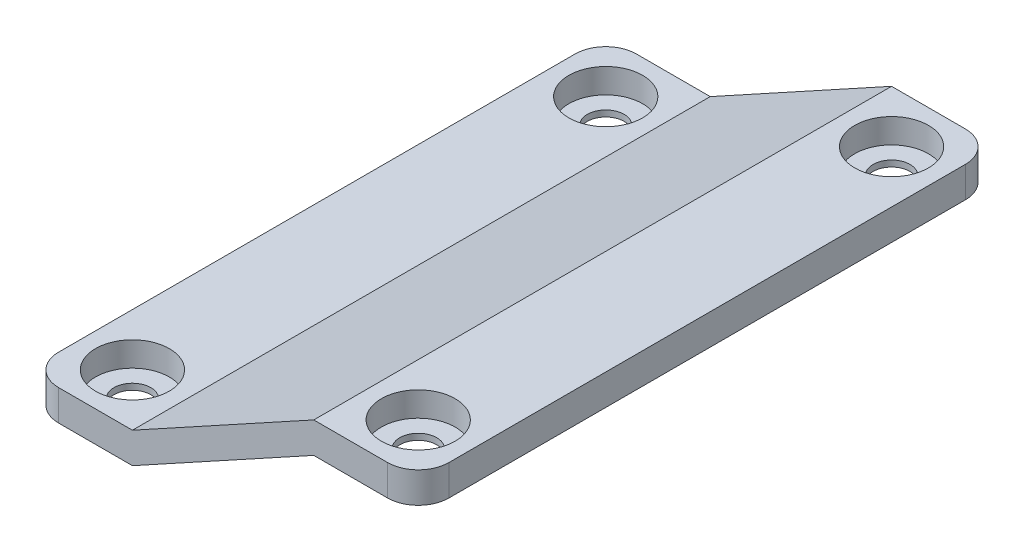
ISO-10303-21;
HEADER;
FILE_DESCRIPTION(('STEP AP214'),'2;1');
FILE_NAME('part.step','',(''),(''),'','','');
FILE_SCHEMA(('AUTOMOTIVE_DESIGN { 1 0 10303 214 1 1 1 1 }'));
ENDSEC;
DATA;
#1=APPLICATION_CONTEXT('core data for automotive mechanical design processes');
#2=APPLICATION_PROTOCOL_DEFINITION('international standard','automotive_design',2000,#1);
#3=PRODUCT_CONTEXT('',#1,'mechanical');
#4=PRODUCT('Part','Part','',(#3));
#5=PRODUCT_RELATED_PRODUCT_CATEGORY('part','',(#4));
#6=PRODUCT_DEFINITION_FORMATION('','',#4);
#7=PRODUCT_DEFINITION_CONTEXT('part definition',#1,'design');
#8=PRODUCT_DEFINITION('design','',#6,#7);
#9=PRODUCT_DEFINITION_SHAPE('','',#8);
#10=(LENGTH_UNIT() NAMED_UNIT(*) SI_UNIT(.MILLI.,.METRE.));
#11=(NAMED_UNIT(*) PLANE_ANGLE_UNIT() SI_UNIT($,.RADIAN.));
#12=(NAMED_UNIT(*) SI_UNIT($,.STERADIAN.) SOLID_ANGLE_UNIT());
#13=UNCERTAINTY_MEASURE_WITH_UNIT(LENGTH_MEASURE(1.E-05),#10,'distance_accuracy_value','');
#14=(GEOMETRIC_REPRESENTATION_CONTEXT(3) GLOBAL_UNCERTAINTY_ASSIGNED_CONTEXT((#13)) GLOBAL_UNIT_ASSIGNED_CONTEXT((#10,
#11,#12)) REPRESENTATION_CONTEXT('',''));
#15=CARTESIAN_POINT('',(0.,0.,0.));
#16=DIRECTION('',(0.,0.,1.));
#17=DIRECTION('',(1.,0.,0.));
#18=AXIS2_PLACEMENT_3D('',#15,#16,#17);
#19=CARTESIAN_POINT('',(-15.0077541769523,-9.56898329219079,-94.));
#20=DIRECTION('',(0.48134834326553,-0.876529390514391,0.));
#21=DIRECTION('',(0.876529390514391,0.48134834326553,0.));
#22=AXIS2_PLACEMENT_3D('',#19,#20,#21);
#23=PLANE('',#22);
#24=DIRECTION('',(0.876529390514391,0.48134834326553,0.));
#25=VECTOR('',#24,1.);
#26=CARTESIAN_POINT('',(-15.0077541769523,-9.56898329219079,0.));
#27=LINE('',#26,#25);
#28=CARTESIAN_POINT('',(-15.0077541769523,-9.56898329219079,0.));
#29=VERTEX_POINT('',#28);
#30=CARTESIAN_POINT('',(14.4922458230477,6.6310167078092,0.));
#31=VERTEX_POINT('',#30);
#32=EDGE_CURVE('E179',#29,#31,#27,.T.);
#33=ORIENTED_EDGE('',*,*,#32,.F.);
#34=DIRECTION('',(0.,0.,1.));
#35=VECTOR('',#34,1.);
#36=CARTESIAN_POINT('',(-15.0077541769523,-9.56898329219079,-94.));
#37=LINE('',#36,#35);
#38=CARTESIAN_POINT('',(-15.0077541769523,-9.56898329219079,-94.));
#39=VERTEX_POINT('',#38);
#40=EDGE_CURVE('E156',#39,#29,#37,.T.);
#41=ORIENTED_EDGE('',*,*,#40,.F.);
#42=DIRECTION('',(0.876529390514391,0.48134834326553,0.));
#43=VECTOR('',#42,1.);
#44=CARTESIAN_POINT('',(-15.0077541769523,-9.56898329219079,-94.));
#45=LINE('',#44,#43);
#46=CARTESIAN_POINT('',(14.4922458230477,6.6310167078092,-94.));
#47=VERTEX_POINT('',#46);
#48=EDGE_CURVE('E147',#39,#47,#45,.T.);
#49=ORIENTED_EDGE('',*,*,#48,.T.);
#50=DIRECTION('',(0.,0.,1.));
#51=VECTOR('',#50,1.);
#52=CARTESIAN_POINT('',(14.4922458230477,6.6310167078092,-94.));
#53=LINE('',#52,#51);
#54=EDGE_CURVE('E129',#47,#31,#53,.T.);
#55=ORIENTED_EDGE('',*,*,#54,.T.);
#56=EDGE_LOOP('',(#33,#41,#49,#55));
#57=FACE_BOUND('',#56,.T.);
#58=ADVANCED_FACE('F39',(#57),#23,.T.);
#59=CARTESIAN_POINT('',(-15.0077541769523,-9.56898329219079,-94.));
#60=DIRECTION('',(0.,-1.,0.));
#61=DIRECTION('',(1.,0.,0.));
#62=AXIS2_PLACEMENT_3D('',#59,#60,#61);
#63=PLANE('',#62);
#64=CARTESIAN_POINT('',(-23.5077541769523,-9.56898329219079,-85.5));
#65=DIRECTION('',(0.,1.,0.));
#66=DIRECTION('',(0.,0.,1.));
#67=AXIS2_PLACEMENT_3D('',#64,#65,#66);
#68=CIRCLE('',#67,3.);
#69=CARTESIAN_POINT('',(-23.5077541769523,-9.56898329219079,-82.5));
#70=VERTEX_POINT('',#69);
#71=EDGE_CURVE('E427',#70,#70,#68,.T.);
#72=ORIENTED_EDGE('',*,*,#71,.T.);
#73=EDGE_LOOP('',(#72));
#74=FACE_BOUND('',#73,.T.);
#75=CARTESIAN_POINT('',(-23.5077541769523,-9.56898329219079,-8.5));
#76=DIRECTION('',(0.,1.,0.));
#77=DIRECTION('',(0.,0.,1.));
#78=AXIS2_PLACEMENT_3D('',#75,#76,#77);
#79=CIRCLE('',#78,3.);
#80=CARTESIAN_POINT('',(-23.5077541769523,-9.56898329219079,-5.5));
#81=VERTEX_POINT('',#80);
#82=EDGE_CURVE('E164',#81,#81,#79,.T.);
#83=ORIENTED_EDGE('',*,*,#82,.T.);
#84=EDGE_LOOP('',(#83));
#85=FACE_BOUND('',#84,.T.);
#86=DIRECTION('',(0.,0.,1.));
#87=VECTOR('',#86,1.);
#88=CARTESIAN_POINT('',(-32.0077541769523,-9.5689832921908,-94.));
#89=LINE('',#88,#87);
#90=CARTESIAN_POINT('',(-32.0077541769523,-9.5689832921908,-89.));
#91=VERTEX_POINT('',#90);
#92=CARTESIAN_POINT('',(-32.0077541769523,-9.5689832921908,-5.));
#93=VERTEX_POINT('',#92);
#94=EDGE_CURVE('E197',#91,#93,#89,.T.);
#95=ORIENTED_EDGE('',*,*,#94,.F.);
#96=CARTESIAN_POINT('',(-27.0077541769523,-9.56898329219079,-89.));
#97=DIRECTION('',(0.,-1.,0.));
#98=DIRECTION('',(1.,0.,0.));
#99=AXIS2_PLACEMENT_3D('',#96,#97,#98);
#100=CIRCLE('',#99,5.);
#101=CARTESIAN_POINT('',(-27.0077541769523,-9.56898329219079,-94.));
#102=VERTEX_POINT('',#101);
#103=EDGE_CURVE('E227',#91,#102,#100,.T.);
#104=ORIENTED_EDGE('',*,*,#103,.T.);
#105=DIRECTION('',(1.,0.,0.));
#106=VECTOR('',#105,1.);
#107=CARTESIAN_POINT('',(-15.0077541769523,-9.56898329219079,-94.));
#108=LINE('',#107,#106);
#109=EDGE_CURVE('E141',#102,#39,#108,.T.);
#110=ORIENTED_EDGE('',*,*,#109,.T.);
#111=ORIENTED_EDGE('',*,*,#40,.T.);
#112=DIRECTION('',(1.,0.,0.));
#113=VECTOR('',#112,1.);
#114=CARTESIAN_POINT('',(-15.0077541769523,-9.56898329219079,0.));
#115=LINE('',#114,#113);
#116=CARTESIAN_POINT('',(-27.0077541769523,-9.56898329219079,0.));
#117=VERTEX_POINT('',#116);
#118=EDGE_CURVE('E158',#117,#29,#115,.T.);
#119=ORIENTED_EDGE('',*,*,#118,.F.);
#120=CARTESIAN_POINT('',(-27.0077541769523,-9.56898329219079,-5.));
#121=DIRECTION('',(0.,-1.,0.));
#122=DIRECTION('',(1.,0.,0.));
#123=AXIS2_PLACEMENT_3D('',#120,#121,#122);
#124=CIRCLE('',#123,5.);
#125=EDGE_CURVE('E224',#117,#93,#124,.T.);
#126=ORIENTED_EDGE('',*,*,#125,.T.);
#127=EDGE_LOOP('',(#95,#104,#110,#111,#119,#126));
#128=FACE_BOUND('',#127,.T.);
#129=ADVANCED_FACE('F268',(#74,#85,#128),#63,.T.);
#130=CARTESIAN_POINT('',(-32.0077541769523,-9.5689832921908,-94.));
#131=DIRECTION('',(-1.,0.,0.));
#132=DIRECTION('',(0.,0.,1.));
#133=AXIS2_PLACEMENT_3D('',#130,#131,#132);
#134=PLANE('',#133);
#135=DIRECTION('',(0.,0.,1.));
#136=VECTOR('',#135,1.);
#137=CARTESIAN_POINT('',(-32.0077541769523,-4.5689832921908,-94.));
#138=LINE('',#137,#136);
#139=CARTESIAN_POINT('',(-32.0077541769523,-4.5689832921908,-89.));
#140=VERTEX_POINT('',#139);
#141=CARTESIAN_POINT('',(-32.0077541769523,-4.5689832921908,-5.));
#142=VERTEX_POINT('',#141);
#143=EDGE_CURVE('E201',#140,#142,#138,.T.);
#144=ORIENTED_EDGE('',*,*,#143,.F.);
#145=DIRECTION('',(0.,-1.,0.));
#146=VECTOR('',#145,1.);
#147=CARTESIAN_POINT('',(-32.0077541769523,-9.5689832921908,-89.));
#148=LINE('',#147,#146);
#149=EDGE_CURVE('E220',#140,#91,#148,.T.);
#150=ORIENTED_EDGE('',*,*,#149,.T.);
#151=ORIENTED_EDGE('',*,*,#94,.T.);
#152=DIRECTION('',(0.,-1.,0.));
#153=VECTOR('',#152,1.);
#154=CARTESIAN_POINT('',(-32.0077541769523,-9.5689832921908,-5.));
#155=LINE('',#154,#153);
#156=EDGE_CURVE('E196',#93,#142,#155,.F.);
#157=ORIENTED_EDGE('',*,*,#156,.T.);
#158=EDGE_LOOP('',(#144,#150,#151,#157));
#159=FACE_BOUND('',#158,.T.);
#160=ADVANCED_FACE('F291',(#159),#134,.T.);
#161=CARTESIAN_POINT('',(-15.0077541769523,-4.5689832921908,-94.));
#162=DIRECTION('',(0.,1.,0.));
#163=DIRECTION('',(-1.,0.,0.));
#164=AXIS2_PLACEMENT_3D('',#161,#162,#163);
#165=PLANE('',#164);
#166=CARTESIAN_POINT('',(-23.5077541769523,-4.56898329219079,-85.5));
#167=DIRECTION('',(0.,1.,0.));
#168=DIRECTION('',(0.,0.,1.));
#169=AXIS2_PLACEMENT_3D('',#166,#167,#168);
#170=CIRCLE('',#169,6.);
#171=CARTESIAN_POINT('',(-23.5077541769523,-4.56898329219079,-79.5));
#172=VERTEX_POINT('',#171);
#173=EDGE_CURVE('E415',#172,#172,#170,.T.);
#174=ORIENTED_EDGE('',*,*,#173,.F.);
#175=EDGE_LOOP('',(#174));
#176=FACE_BOUND('',#175,.T.);
#177=CARTESIAN_POINT('',(-23.5077541769523,-4.56898329219079,-8.5));
#178=DIRECTION('',(0.,1.,0.));
#179=DIRECTION('',(0.,0.,1.));
#180=AXIS2_PLACEMENT_3D('',#177,#178,#179);
#181=CIRCLE('',#180,6.);
#182=CARTESIAN_POINT('',(-23.5077541769523,-4.56898329219079,-2.5));
#183=VERTEX_POINT('',#182);
#184=EDGE_CURVE('E431',#183,#183,#181,.T.);
#185=ORIENTED_EDGE('',*,*,#184,.F.);
#186=EDGE_LOOP('',(#185));
#187=FACE_BOUND('',#186,.T.);
#188=DIRECTION('',(-1.,0.,0.));
#189=VECTOR('',#188,1.);
#190=CARTESIAN_POINT('',(-15.0077541769523,-4.5689832921908,-94.));
#191=LINE('',#190,#189);
#192=CARTESIAN_POINT('',(-15.0077541769523,-4.5689832921908,-94.));
#193=VERTEX_POINT('',#192);
#194=CARTESIAN_POINT('',(-27.0077541769523,-4.5689832921908,-94.));
#195=VERTEX_POINT('',#194);
#196=EDGE_CURVE('E173',#193,#195,#191,.T.);
#197=ORIENTED_EDGE('',*,*,#196,.T.);
#198=CARTESIAN_POINT('',(-27.0077541769523,-4.5689832921908,-89.));
#199=DIRECTION('',(0.,1.,0.));
#200=DIRECTION('',(-1.,0.,0.));
#201=AXIS2_PLACEMENT_3D('',#198,#199,#200);
#202=CIRCLE('',#201,5.);
#203=EDGE_CURVE('E238',#195,#140,#202,.T.);
#204=ORIENTED_EDGE('',*,*,#203,.T.);
#205=ORIENTED_EDGE('',*,*,#143,.T.);
#206=CARTESIAN_POINT('',(-27.0077541769523,-4.5689832921908,-5.));
#207=DIRECTION('',(0.,1.,0.));
#208=DIRECTION('',(-1.,0.,0.));
#209=AXIS2_PLACEMENT_3D('',#206,#207,#208);
#210=CIRCLE('',#209,5.);
#211=CARTESIAN_POINT('',(-27.0077541769523,-4.5689832921908,0.));
#212=VERTEX_POINT('',#211);
#213=EDGE_CURVE('E235',#142,#212,#210,.T.);
#214=ORIENTED_EDGE('',*,*,#213,.T.);
#215=DIRECTION('',(-1.,0.,0.));
#216=VECTOR('',#215,1.);
#217=CARTESIAN_POINT('',(-15.0077541769523,-4.5689832921908,0.));
#218=LINE('',#217,#216);
#219=CARTESIAN_POINT('',(-15.0077541769523,-4.5689832921908,0.));
#220=VERTEX_POINT('',#219);
#221=EDGE_CURVE('E161',#220,#212,#218,.T.);
#222=ORIENTED_EDGE('',*,*,#221,.F.);
#223=DIRECTION('',(0.,0.,1.));
#224=VECTOR('',#223,1.);
#225=CARTESIAN_POINT('',(-15.0077541769523,-4.5689832921908,-94.));
#226=LINE('',#225,#224);
#227=EDGE_CURVE('E205',#193,#220,#226,.T.);
#228=ORIENTED_EDGE('',*,*,#227,.F.);
#229=EDGE_LOOP('',(#197,#204,#205,#214,#222,#228));
#230=FACE_BOUND('',#229,.T.);
#231=ADVANCED_FACE('F287',(#176,#187,#230),#165,.T.);
#232=CARTESIAN_POINT('',(-15.0077541769523,-4.5689832921908,-94.));
#233=DIRECTION('',(-0.48134834326553,0.876529390514391,0.));
#234=DIRECTION('',(-0.876529390514391,-0.48134834326553,0.));
#235=AXIS2_PLACEMENT_3D('',#232,#233,#234);
#236=PLANE('',#235);
#237=DIRECTION('',(-0.876529390514391,-0.48134834326553,0.));
#238=VECTOR('',#237,1.);
#239=CARTESIAN_POINT('',(-15.0077541769523,-4.5689832921908,0.));
#240=LINE('',#239,#238);
#241=CARTESIAN_POINT('',(14.4922458230477,11.6310167078092,0.));
#242=VERTEX_POINT('',#241);
#243=EDGE_CURVE('E187',#242,#220,#240,.T.);
#244=ORIENTED_EDGE('',*,*,#243,.F.);
#245=DIRECTION('',(0.,0.,1.));
#246=VECTOR('',#245,1.);
#247=CARTESIAN_POINT('',(14.4922458230477,11.6310167078092,-94.));
#248=LINE('',#247,#246);
#249=CARTESIAN_POINT('',(14.4922458230477,11.6310167078092,-94.));
#250=VERTEX_POINT('',#249);
#251=EDGE_CURVE('E208',#250,#242,#248,.T.);
#252=ORIENTED_EDGE('',*,*,#251,.F.);
#253=DIRECTION('',(-0.876529390514391,-0.48134834326553,0.));
#254=VECTOR('',#253,1.);
#255=CARTESIAN_POINT('',(-15.0077541769523,-4.5689832921908,-94.));
#256=LINE('',#255,#254);
#257=EDGE_CURVE('E169',#250,#193,#256,.T.);
#258=ORIENTED_EDGE('',*,*,#257,.T.);
#259=ORIENTED_EDGE('',*,*,#227,.T.);
#260=EDGE_LOOP('',(#244,#252,#258,#259));
#261=FACE_BOUND('',#260,.T.);
#262=ADVANCED_FACE('F283',(#261),#236,.T.);
#263=CARTESIAN_POINT('',(14.4922458230477,11.6310167078092,-94.));
#264=DIRECTION('',(0.,1.,0.));
#265=DIRECTION('',(0.,0.,1.));
#266=AXIS2_PLACEMENT_3D('',#263,#264,#265);
#267=PLANE('',#266);
#268=CARTESIAN_POINT('',(22.9922458230477,11.6310167078092,-8.49999999999999));
#269=DIRECTION('',(0.,1.,0.));
#270=DIRECTION('',(0.,0.,1.));
#271=AXIS2_PLACEMENT_3D('',#268,#269,#270);
#272=CIRCLE('',#271,6.);
#273=CARTESIAN_POINT('',(22.9922458230477,11.6310167078092,-2.5));
#274=VERTEX_POINT('',#273);
#275=EDGE_CURVE('E387',#274,#274,#272,.T.);
#276=ORIENTED_EDGE('',*,*,#275,.F.);
#277=EDGE_LOOP('',(#276));
#278=FACE_BOUND('',#277,.T.);
#279=CARTESIAN_POINT('',(22.9922458230477,11.6310167078092,-85.5));
#280=DIRECTION('',(0.,1.,0.));
#281=DIRECTION('',(0.,0.,1.));
#282=AXIS2_PLACEMENT_3D('',#279,#280,#281);
#283=CIRCLE('',#282,6.);
#284=CARTESIAN_POINT('',(22.9922458230477,11.6310167078092,-79.5));
#285=VERTEX_POINT('',#284);
#286=EDGE_CURVE('E399',#285,#285,#283,.T.);
#287=ORIENTED_EDGE('',*,*,#286,.F.);
#288=EDGE_LOOP('',(#287));
#289=FACE_BOUND('',#288,.T.);
#290=DIRECTION('',(0.,0.,1.));
#291=VECTOR('',#290,1.);
#292=CARTESIAN_POINT('',(31.4922458230477,11.6310167078092,-94.));
#293=LINE('',#292,#291);
#294=CARTESIAN_POINT('',(31.4922458230477,11.6310167078092,-89.));
#295=VERTEX_POINT('',#294);
#296=CARTESIAN_POINT('',(31.4922458230477,11.6310167078092,-5.));
#297=VERTEX_POINT('',#296);
#298=EDGE_CURVE('E212',#295,#297,#293,.T.);
#299=ORIENTED_EDGE('',*,*,#298,.F.);
#300=CARTESIAN_POINT('',(26.4922458230477,11.6310167078092,-89.));
#301=DIRECTION('',(0.,1.,0.));
#302=DIRECTION('',(0.,0.,1.));
#303=AXIS2_PLACEMENT_3D('',#300,#301,#302);
#304=CIRCLE('',#303,5.);
#305=CARTESIAN_POINT('',(26.4922458230477,11.6310167078092,-94.));
#306=VERTEX_POINT('',#305);
#307=EDGE_CURVE('E250',#295,#306,#304,.T.);
#308=ORIENTED_EDGE('',*,*,#307,.T.);
#309=DIRECTION('',(-1.,0.,0.));
#310=VECTOR('',#309,1.);
#311=CARTESIAN_POINT('',(14.4922458230477,11.6310167078092,-94.));
#312=LINE('',#311,#310);
#313=EDGE_CURVE('E152',#306,#250,#312,.T.);
#314=ORIENTED_EDGE('',*,*,#313,.T.);
#315=ORIENTED_EDGE('',*,*,#251,.T.);
#316=DIRECTION('',(-1.,0.,0.));
#317=VECTOR('',#316,1.);
#318=CARTESIAN_POINT('',(14.4922458230477,11.6310167078092,0.));
#319=LINE('',#318,#317);
#320=CARTESIAN_POINT('',(26.4922458230477,11.6310167078092,0.));
#321=VERTEX_POINT('',#320);
#322=EDGE_CURVE('E184',#321,#242,#319,.T.);
#323=ORIENTED_EDGE('',*,*,#322,.F.);
#324=CARTESIAN_POINT('',(26.4922458230477,11.6310167078092,-5.));
#325=DIRECTION('',(0.,1.,0.));
#326=DIRECTION('',(0.,0.,1.));
#327=AXIS2_PLACEMENT_3D('',#324,#325,#326);
#328=CIRCLE('',#327,5.);
#329=EDGE_CURVE('E63',#321,#297,#328,.T.);
#330=ORIENTED_EDGE('',*,*,#329,.T.);
#331=EDGE_LOOP('',(#299,#308,#314,#315,#323,#330));
#332=FACE_BOUND('',#331,.T.);
#333=ADVANCED_FACE('F279',(#278,#289,#332),#267,.T.);
#334=CARTESIAN_POINT('',(31.4922458230477,6.6310167078092,-94.));
#335=DIRECTION('',(1.,0.,0.));
#336=DIRECTION('',(0.,0.,-1.));
#337=AXIS2_PLACEMENT_3D('',#334,#335,#336);
#338=PLANE('',#337);
#339=DIRECTION('',(0.,0.,1.));
#340=VECTOR('',#339,1.);
#341=CARTESIAN_POINT('',(31.4922458230477,6.6310167078092,-94.));
#342=LINE('',#341,#340);
#343=CARTESIAN_POINT('',(31.4922458230477,6.6310167078092,-89.));
#344=VERTEX_POINT('',#343);
#345=CARTESIAN_POINT('',(31.4922458230477,6.6310167078092,-5.));
#346=VERTEX_POINT('',#345);
#347=EDGE_CURVE('E140',#344,#346,#342,.T.);
#348=ORIENTED_EDGE('',*,*,#347,.F.);
#349=DIRECTION('',(0.,1.,0.));
#350=VECTOR('',#349,1.);
#351=CARTESIAN_POINT('',(31.4922458230477,11.6310167078092,-89.));
#352=LINE('',#351,#350);
#353=EDGE_CURVE('E244',#344,#295,#352,.T.);
#354=ORIENTED_EDGE('',*,*,#353,.T.);
#355=ORIENTED_EDGE('',*,*,#298,.T.);
#356=DIRECTION('',(0.,1.,0.));
#357=VECTOR('',#356,1.);
#358=CARTESIAN_POINT('',(31.4922458230477,6.6310167078092,-5.));
#359=LINE('',#358,#357);
#360=EDGE_CURVE('E241',#297,#346,#359,.F.);
#361=ORIENTED_EDGE('',*,*,#360,.T.);
#362=EDGE_LOOP('',(#348,#354,#355,#361));
#363=FACE_BOUND('',#362,.T.);
#364=ADVANCED_FACE('F273',(#363),#338,.T.);
#365=CARTESIAN_POINT('',(14.4922458230477,6.6310167078092,-94.));
#366=DIRECTION('',(0.,-1.,0.));
#367=DIRECTION('',(0.,0.,-1.));
#368=AXIS2_PLACEMENT_3D('',#365,#366,#367);
#369=PLANE('',#368);
#370=CARTESIAN_POINT('',(22.9922458230477,6.6310167078092,-8.49999999999999));
#371=DIRECTION('',(0.,-1.,0.));
#372=DIRECTION('',(0.,0.,-1.));
#373=AXIS2_PLACEMENT_3D('',#370,#371,#372);
#374=CIRCLE('',#373,3.);
#375=CARTESIAN_POINT('',(22.9922458230477,6.6310167078092,-11.5));
#376=VERTEX_POINT('',#375);
#377=EDGE_CURVE('E391',#376,#376,#374,.T.);
#378=ORIENTED_EDGE('',*,*,#377,.F.);
#379=EDGE_LOOP('',(#378));
#380=FACE_BOUND('',#379,.T.);
#381=CARTESIAN_POINT('',(22.9922458230477,6.6310167078092,-85.5));
#382=DIRECTION('',(0.,-1.,0.));
#383=DIRECTION('',(0.,0.,-1.));
#384=AXIS2_PLACEMENT_3D('',#381,#382,#383);
#385=CIRCLE('',#384,3.);
#386=CARTESIAN_POINT('',(22.9922458230477,6.6310167078092,-88.5));
#387=VERTEX_POINT('',#386);
#388=EDGE_CURVE('E411',#387,#387,#385,.T.);
#389=ORIENTED_EDGE('',*,*,#388,.F.);
#390=EDGE_LOOP('',(#389));
#391=FACE_BOUND('',#390,.T.);
#392=DIRECTION('',(1.,0.,0.));
#393=VECTOR('',#392,1.);
#394=CARTESIAN_POINT('',(14.4922458230477,6.6310167078092,-94.));
#395=LINE('',#394,#393);
#396=CARTESIAN_POINT('',(26.4922458230477,6.6310167078092,-94.));
#397=VERTEX_POINT('',#396);
#398=EDGE_CURVE('E132',#47,#397,#395,.T.);
#399=ORIENTED_EDGE('',*,*,#398,.T.);
#400=CARTESIAN_POINT('',(26.4922458230477,6.6310167078092,-89.));
#401=DIRECTION('',(0.,-1.,0.));
#402=DIRECTION('',(0.,0.,-1.));
#403=AXIS2_PLACEMENT_3D('',#400,#401,#402);
#404=CIRCLE('',#403,5.);
#405=EDGE_CURVE('E255',#397,#344,#404,.T.);
#406=ORIENTED_EDGE('',*,*,#405,.T.);
#407=ORIENTED_EDGE('',*,*,#347,.T.);
#408=CARTESIAN_POINT('',(26.4922458230477,6.6310167078092,-5.));
#409=DIRECTION('',(0.,-1.,0.));
#410=DIRECTION('',(0.,0.,-1.));
#411=AXIS2_PLACEMENT_3D('',#408,#409,#410);
#412=CIRCLE('',#411,5.);
#413=CARTESIAN_POINT('',(26.4922458230477,6.6310167078092,0.));
#414=VERTEX_POINT('',#413);
#415=EDGE_CURVE('E55',#346,#414,#412,.T.);
#416=ORIENTED_EDGE('',*,*,#415,.T.);
#417=DIRECTION('',(1.,0.,0.));
#418=VECTOR('',#417,1.);
#419=CARTESIAN_POINT('',(14.4922458230477,6.6310167078092,0.));
#420=LINE('',#419,#418);
#421=EDGE_CURVE('E134',#31,#414,#420,.T.);
#422=ORIENTED_EDGE('',*,*,#421,.F.);
#423=ORIENTED_EDGE('',*,*,#54,.F.);
#424=EDGE_LOOP('',(#399,#406,#407,#416,#422,#423));
#425=FACE_BOUND('',#424,.T.);
#426=ADVANCED_FACE('F131',(#380,#391,#425),#369,.T.);
#427=CARTESIAN_POINT('',(0.,0.,-94.));
#428=DIRECTION('',(0.,0.,1.));
#429=DIRECTION('',(1.,0.,0.));
#430=AXIS2_PLACEMENT_3D('',#427,#428,#429);
#431=PLANE('',#430);
#432=ORIENTED_EDGE('',*,*,#109,.F.);
#433=DIRECTION('',(0.,-1.,0.));
#434=VECTOR('',#433,1.);
#435=CARTESIAN_POINT('',(-27.0077541769523,-4.5689832921908,-94.));
#436=LINE('',#435,#434);
#437=EDGE_CURVE('E232',#102,#195,#436,.F.);
#438=ORIENTED_EDGE('',*,*,#437,.T.);
#439=ORIENTED_EDGE('',*,*,#196,.F.);
#440=ORIENTED_EDGE('',*,*,#257,.F.);
#441=ORIENTED_EDGE('',*,*,#313,.F.);
#442=DIRECTION('',(0.,1.,0.));
#443=VECTOR('',#442,1.);
#444=CARTESIAN_POINT('',(26.4922458230477,6.6310167078092,-94.));
#445=LINE('',#444,#443);
#446=EDGE_CURVE('E150',#306,#397,#445,.F.);
#447=ORIENTED_EDGE('',*,*,#446,.T.);
#448=ORIENTED_EDGE('',*,*,#398,.F.);
#449=ORIENTED_EDGE('',*,*,#48,.F.);
#450=EDGE_LOOP('',(#432,#438,#439,#440,#441,#447,#448,#449));
#451=FACE_BOUND('',#450,.T.);
#452=ADVANCED_FACE('F146',(#451),#431,.F.);
#453=CARTESIAN_POINT('',(0.,0.,0.));
#454=DIRECTION('',(0.,0.,1.));
#455=DIRECTION('',(1.,0.,0.));
#456=AXIS2_PLACEMENT_3D('',#453,#454,#455);
#457=PLANE('',#456);
#458=ORIENTED_EDGE('',*,*,#421,.T.);
#459=DIRECTION('',(0.,1.,0.));
#460=VECTOR('',#459,1.);
#461=CARTESIAN_POINT('',(26.4922458230477,0.,0.));
#462=LINE('',#461,#460);
#463=EDGE_CURVE('E11',#414,#321,#462,.T.);
#464=ORIENTED_EDGE('',*,*,#463,.T.);
#465=ORIENTED_EDGE('',*,*,#322,.T.);
#466=ORIENTED_EDGE('',*,*,#243,.T.);
#467=ORIENTED_EDGE('',*,*,#221,.T.);
#468=DIRECTION('',(0.,-1.,0.));
#469=VECTOR('',#468,1.);
#470=CARTESIAN_POINT('',(-27.0077541769523,0.,0.));
#471=LINE('',#470,#469);
#472=EDGE_CURVE('E48',#212,#117,#471,.T.);
#473=ORIENTED_EDGE('',*,*,#472,.T.);
#474=ORIENTED_EDGE('',*,*,#118,.T.);
#475=ORIENTED_EDGE('',*,*,#32,.T.);
#476=EDGE_LOOP('',(#458,#464,#465,#466,#467,#473,#474,#475));
#477=FACE_BOUND('',#476,.T.);
#478=ADVANCED_FACE('F262',(#477),#457,.T.);
#479=CARTESIAN_POINT('',(-23.5077541769523,-4.56898329219079,-8.5));
#480=DIRECTION('',(0.,1.,0.));
#481=DIRECTION('',(0.,0.,1.));
#482=AXIS2_PLACEMENT_3D('',#479,#480,#481);
#483=CYLINDRICAL_SURFACE('',#482,3.);
#484=ORIENTED_EDGE('',*,*,#82,.F.);
#485=EDGE_LOOP('',(#484));
#486=FACE_BOUND('',#485,.T.);
#487=CARTESIAN_POINT('',(-23.5077541769523,-8.5689832921908,-8.5));
#488=DIRECTION('',(0.,1.,0.));
#489=DIRECTION('',(0.,0.,1.));
#490=AXIS2_PLACEMENT_3D('',#487,#488,#489);
#491=CIRCLE('',#490,3.);
#492=CARTESIAN_POINT('',(-23.5077541769523,-8.5689832921908,-5.5));
#493=VERTEX_POINT('',#492);
#494=EDGE_CURVE('E438',#493,#493,#491,.T.);
#495=ORIENTED_EDGE('',*,*,#494,.T.);
#496=EDGE_LOOP('',(#495));
#497=FACE_BOUND('',#496,.T.);
#498=ADVANCED_FACE('F333',(#486,#497),#483,.F.);
#499=CARTESIAN_POINT('',(-20.5077541769523,-8.5689832921908,-8.5));
#500=DIRECTION('',(0.,-1.,0.));
#501=DIRECTION('',(0.,0.,-1.));
#502=AXIS2_PLACEMENT_3D('',#499,#500,#501);
#503=PLANE('',#502);
#504=ORIENTED_EDGE('',*,*,#494,.F.);
#505=EDGE_LOOP('',(#504));
#506=FACE_BOUND('',#505,.T.);
#507=CARTESIAN_POINT('',(-23.5077541769523,-8.5689832921908,-8.5));
#508=DIRECTION('',(0.,1.,0.));
#509=DIRECTION('',(0.,0.,1.));
#510=AXIS2_PLACEMENT_3D('',#507,#508,#509);
#511=CIRCLE('',#510,6.);
#512=CARTESIAN_POINT('',(-23.5077541769523,-8.5689832921908,-2.5));
#513=VERTEX_POINT('',#512);
#514=EDGE_CURVE('E435',#513,#513,#511,.T.);
#515=ORIENTED_EDGE('',*,*,#514,.T.);
#516=EDGE_LOOP('',(#515));
#517=FACE_BOUND('',#516,.T.);
#518=ADVANCED_FACE('F338',(#506,#517),#503,.F.);
#519=CARTESIAN_POINT('',(-23.5077541769523,-4.56898329219079,-8.5));
#520=DIRECTION('',(0.,1.,0.));
#521=DIRECTION('',(0.,0.,1.));
#522=AXIS2_PLACEMENT_3D('',#519,#520,#521);
#523=CYLINDRICAL_SURFACE('',#522,6.);
#524=ORIENTED_EDGE('',*,*,#514,.F.);
#525=EDGE_LOOP('',(#524));
#526=FACE_BOUND('',#525,.T.);
#527=ORIENTED_EDGE('',*,*,#184,.T.);
#528=EDGE_LOOP('',(#527));
#529=FACE_BOUND('',#528,.T.);
#530=ADVANCED_FACE('F342',(#526,#529),#523,.F.);
#531=CARTESIAN_POINT('',(-23.5077541769523,-4.56898329219079,-85.5));
#532=DIRECTION('',(0.,1.,0.));
#533=DIRECTION('',(0.,0.,1.));
#534=AXIS2_PLACEMENT_3D('',#531,#532,#533);
#535=CYLINDRICAL_SURFACE('',#534,3.);
#536=ORIENTED_EDGE('',*,*,#71,.F.);
#537=EDGE_LOOP('',(#536));
#538=FACE_BOUND('',#537,.T.);
#539=CARTESIAN_POINT('',(-23.5077541769523,-8.5689832921908,-85.5));
#540=DIRECTION('',(0.,1.,0.));
#541=DIRECTION('',(0.,0.,1.));
#542=AXIS2_PLACEMENT_3D('',#539,#540,#541);
#543=CIRCLE('',#542,3.);
#544=CARTESIAN_POINT('',(-23.5077541769523,-8.5689832921908,-82.5));
#545=VERTEX_POINT('',#544);
#546=EDGE_CURVE('E423',#545,#545,#543,.T.);
#547=ORIENTED_EDGE('',*,*,#546,.T.);
#548=EDGE_LOOP('',(#547));
#549=FACE_BOUND('',#548,.T.);
#550=ADVANCED_FACE('F346',(#538,#549),#535,.F.);
#551=CARTESIAN_POINT('',(-20.5077541769523,-8.5689832921908,-85.5));
#552=DIRECTION('',(0.,-1.,0.));
#553=DIRECTION('',(0.,0.,-1.));
#554=AXIS2_PLACEMENT_3D('',#551,#552,#553);
#555=PLANE('',#554);
#556=ORIENTED_EDGE('',*,*,#546,.F.);
#557=EDGE_LOOP('',(#556));
#558=FACE_BOUND('',#557,.T.);
#559=CARTESIAN_POINT('',(-23.5077541769523,-8.5689832921908,-85.5));
#560=DIRECTION('',(0.,1.,0.));
#561=DIRECTION('',(0.,0.,1.));
#562=AXIS2_PLACEMENT_3D('',#559,#560,#561);
#563=CIRCLE('',#562,6.);
#564=CARTESIAN_POINT('',(-23.5077541769523,-8.5689832921908,-79.5));
#565=VERTEX_POINT('',#564);
#566=EDGE_CURVE('E419',#565,#565,#563,.T.);
#567=ORIENTED_EDGE('',*,*,#566,.T.);
#568=EDGE_LOOP('',(#567));
#569=FACE_BOUND('',#568,.T.);
#570=ADVANCED_FACE('F350',(#558,#569),#555,.F.);
#571=CARTESIAN_POINT('',(-23.5077541769523,-4.56898329219079,-85.5));
#572=DIRECTION('',(0.,1.,0.));
#573=DIRECTION('',(0.,0.,1.));
#574=AXIS2_PLACEMENT_3D('',#571,#572,#573);
#575=CYLINDRICAL_SURFACE('',#574,6.);
#576=ORIENTED_EDGE('',*,*,#566,.F.);
#577=EDGE_LOOP('',(#576));
#578=FACE_BOUND('',#577,.T.);
#579=ORIENTED_EDGE('',*,*,#173,.T.);
#580=EDGE_LOOP('',(#579));
#581=FACE_BOUND('',#580,.T.);
#582=ADVANCED_FACE('F354',(#578,#581),#575,.F.);
#583=CARTESIAN_POINT('',(22.9922458230477,11.6310167078092,-85.5));
#584=DIRECTION('',(0.,1.,0.));
#585=DIRECTION('',(0.,0.,1.));
#586=AXIS2_PLACEMENT_3D('',#583,#584,#585);
#587=CYLINDRICAL_SURFACE('',#586,3.);
#588=CARTESIAN_POINT('',(22.9922458230477,7.63101670780921,-85.5));
#589=DIRECTION('',(0.,1.,0.));
#590=DIRECTION('',(0.,0.,1.));
#591=AXIS2_PLACEMENT_3D('',#588,#589,#590);
#592=CIRCLE('',#591,3.);
#593=CARTESIAN_POINT('',(22.9922458230477,7.63101670780921,-82.5));
#594=VERTEX_POINT('',#593);
#595=EDGE_CURVE('E407',#594,#594,#592,.T.);
#596=ORIENTED_EDGE('',*,*,#595,.T.);
#597=EDGE_LOOP('',(#596));
#598=FACE_BOUND('',#597,.T.);
#599=ORIENTED_EDGE('',*,*,#388,.T.);
#600=EDGE_LOOP('',(#599));
#601=FACE_BOUND('',#600,.T.);
#602=ADVANCED_FACE('F358',(#598,#601),#587,.F.);
#603=CARTESIAN_POINT('',(25.9922458230477,7.63101670780921,-85.5));
#604=DIRECTION('',(0.,-1.,0.));
#605=DIRECTION('',(0.,0.,-1.));
#606=AXIS2_PLACEMENT_3D('',#603,#604,#605);
#607=PLANE('',#606);
#608=ORIENTED_EDGE('',*,*,#595,.F.);
#609=EDGE_LOOP('',(#608));
#610=FACE_BOUND('',#609,.T.);
#611=CARTESIAN_POINT('',(22.9922458230477,7.63101670780921,-85.5));
#612=DIRECTION('',(0.,1.,0.));
#613=DIRECTION('',(0.,0.,1.));
#614=AXIS2_PLACEMENT_3D('',#611,#612,#613);
#615=CIRCLE('',#614,6.);
#616=CARTESIAN_POINT('',(22.9922458230477,7.63101670780921,-79.5));
#617=VERTEX_POINT('',#616);
#618=EDGE_CURVE('E403',#617,#617,#615,.T.);
#619=ORIENTED_EDGE('',*,*,#618,.T.);
#620=EDGE_LOOP('',(#619));
#621=FACE_BOUND('',#620,.T.);
#622=ADVANCED_FACE('F362',(#610,#621),#607,.F.);
#623=CARTESIAN_POINT('',(22.9922458230477,11.6310167078092,-85.5));
#624=DIRECTION('',(0.,1.,0.));
#625=DIRECTION('',(0.,0.,1.));
#626=AXIS2_PLACEMENT_3D('',#623,#624,#625);
#627=CYLINDRICAL_SURFACE('',#626,6.);
#628=ORIENTED_EDGE('',*,*,#618,.F.);
#629=EDGE_LOOP('',(#628));
#630=FACE_BOUND('',#629,.T.);
#631=ORIENTED_EDGE('',*,*,#286,.T.);
#632=EDGE_LOOP('',(#631));
#633=FACE_BOUND('',#632,.T.);
#634=ADVANCED_FACE('F366',(#630,#633),#627,.F.);
#635=CARTESIAN_POINT('',(22.9922458230477,11.6310167078092,-8.49999999999999));
#636=DIRECTION('',(0.,1.,0.));
#637=DIRECTION('',(0.,0.,1.));
#638=AXIS2_PLACEMENT_3D('',#635,#636,#637);
#639=CYLINDRICAL_SURFACE('',#638,3.);
#640=CARTESIAN_POINT('',(22.9922458230477,7.63101670780921,-8.49999999999999));
#641=DIRECTION('',(0.,1.,0.));
#642=DIRECTION('',(0.,0.,1.));
#643=AXIS2_PLACEMENT_3D('',#640,#641,#642);
#644=CIRCLE('',#643,3.);
#645=CARTESIAN_POINT('',(22.9922458230477,7.63101670780921,-5.49999999999999));
#646=VERTEX_POINT('',#645);
#647=EDGE_CURVE('E382',#646,#646,#644,.T.);
#648=ORIENTED_EDGE('',*,*,#647,.T.);
#649=EDGE_LOOP('',(#648));
#650=FACE_BOUND('',#649,.T.);
#651=ORIENTED_EDGE('',*,*,#377,.T.);
#652=EDGE_LOOP('',(#651));
#653=FACE_BOUND('',#652,.T.);
#654=ADVANCED_FACE('F370',(#650,#653),#639,.F.);
#655=CARTESIAN_POINT('',(25.9922458230477,7.63101670780921,-8.49999999999999));
#656=DIRECTION('',(0.,-1.,0.));
#657=DIRECTION('',(0.,0.,-1.));
#658=AXIS2_PLACEMENT_3D('',#655,#656,#657);
#659=PLANE('',#658);
#660=ORIENTED_EDGE('',*,*,#647,.F.);
#661=EDGE_LOOP('',(#660));
#662=FACE_BOUND('',#661,.T.);
#663=CARTESIAN_POINT('',(22.9922458230477,7.63101670780921,-8.49999999999999));
#664=DIRECTION('',(0.,1.,0.));
#665=DIRECTION('',(0.,0.,1.));
#666=AXIS2_PLACEMENT_3D('',#663,#664,#665);
#667=CIRCLE('',#666,6.);
#668=CARTESIAN_POINT('',(22.9922458230477,7.63101670780921,-2.5));
#669=VERTEX_POINT('',#668);
#670=EDGE_CURVE('E385',#669,#669,#667,.T.);
#671=ORIENTED_EDGE('',*,*,#670,.T.);
#672=EDGE_LOOP('',(#671));
#673=FACE_BOUND('',#672,.T.);
#674=ADVANCED_FACE('F305',(#662,#673),#659,.F.);
#675=CARTESIAN_POINT('',(22.9922458230477,11.6310167078092,-8.49999999999999));
#676=DIRECTION('',(0.,1.,0.));
#677=DIRECTION('',(0.,0.,1.));
#678=AXIS2_PLACEMENT_3D('',#675,#676,#677);
#679=CYLINDRICAL_SURFACE('',#678,6.);
#680=ORIENTED_EDGE('',*,*,#670,.F.);
#681=EDGE_LOOP('',(#680));
#682=FACE_BOUND('',#681,.T.);
#683=ORIENTED_EDGE('',*,*,#275,.T.);
#684=EDGE_LOOP('',(#683));
#685=FACE_BOUND('',#684,.T.);
#686=ADVANCED_FACE('F298',(#682,#685),#679,.F.);
#687=CARTESIAN_POINT('',(-27.0077541769523,-9.5689832921908,-89.));
#688=DIRECTION('',(0.,1.,0.));
#689=DIRECTION('',(0.,0.,1.));
#690=AXIS2_PLACEMENT_3D('',#687,#688,#689);
#691=CYLINDRICAL_SURFACE('',#690,5.);
#692=ORIENTED_EDGE('',*,*,#203,.F.);
#693=ORIENTED_EDGE('',*,*,#437,.F.);
#694=ORIENTED_EDGE('',*,*,#103,.F.);
#695=ORIENTED_EDGE('',*,*,#149,.F.);
#696=EDGE_LOOP('',(#692,#693,#694,#695));
#697=FACE_BOUND('',#696,.T.);
#698=ADVANCED_FACE('F296',(#697),#691,.T.);
#699=CARTESIAN_POINT('',(26.4922458230477,6.6310167078092,-89.));
#700=DIRECTION('',(0.,-1.,0.));
#701=DIRECTION('',(0.,0.,-1.));
#702=AXIS2_PLACEMENT_3D('',#699,#700,#701);
#703=CYLINDRICAL_SURFACE('',#702,5.);
#704=ORIENTED_EDGE('',*,*,#405,.F.);
#705=ORIENTED_EDGE('',*,*,#446,.F.);
#706=ORIENTED_EDGE('',*,*,#307,.F.);
#707=ORIENTED_EDGE('',*,*,#353,.F.);
#708=EDGE_LOOP('',(#704,#705,#706,#707));
#709=FACE_BOUND('',#708,.T.);
#710=ADVANCED_FACE('F277',(#709),#703,.T.);
#711=CARTESIAN_POINT('',(26.4922458230477,0.,-5.));
#712=DIRECTION('',(0.,1.,0.));
#713=DIRECTION('',(0.,0.,1.));
#714=AXIS2_PLACEMENT_3D('',#711,#712,#713);
#715=CYLINDRICAL_SURFACE('',#714,5.);
#716=ORIENTED_EDGE('',*,*,#415,.F.);
#717=ORIENTED_EDGE('',*,*,#360,.F.);
#718=ORIENTED_EDGE('',*,*,#329,.F.);
#719=ORIENTED_EDGE('',*,*,#463,.F.);
#720=EDGE_LOOP('',(#716,#717,#718,#719));
#721=FACE_BOUND('',#720,.T.);
#722=ADVANCED_FACE('F270',(#721),#715,.T.);
#723=CARTESIAN_POINT('',(-27.0077541769523,0.,-5.));
#724=DIRECTION('',(0.,-1.,0.));
#725=DIRECTION('',(0.,0.,-1.));
#726=AXIS2_PLACEMENT_3D('',#723,#724,#725);
#727=CYLINDRICAL_SURFACE('',#726,5.);
#728=ORIENTED_EDGE('',*,*,#213,.F.);
#729=ORIENTED_EDGE('',*,*,#156,.F.);
#730=ORIENTED_EDGE('',*,*,#125,.F.);
#731=ORIENTED_EDGE('',*,*,#472,.F.);
#732=EDGE_LOOP('',(#728,#729,#730,#731));
#733=FACE_BOUND('',#732,.T.);
#734=ADVANCED_FACE('F41',(#733),#727,.T.);
#735=CLOSED_SHELL('',(#58,#129,#160,#231,#262,#333,#364,#426,#452,#478,#498,#518,#530,#550,#570,
#582,#602,#622,#634,#654,#674,#686,#698,#710,#722,#734));
#736=MANIFOLD_SOLID_BREP('B2',#735);
#737=ADVANCED_BREP_SHAPE_REPRESENTATION('',(#18,#736),#14);
#738=SHAPE_DEFINITION_REPRESENTATION(#9,#737);
ENDSEC;
END-ISO-10303-21;
